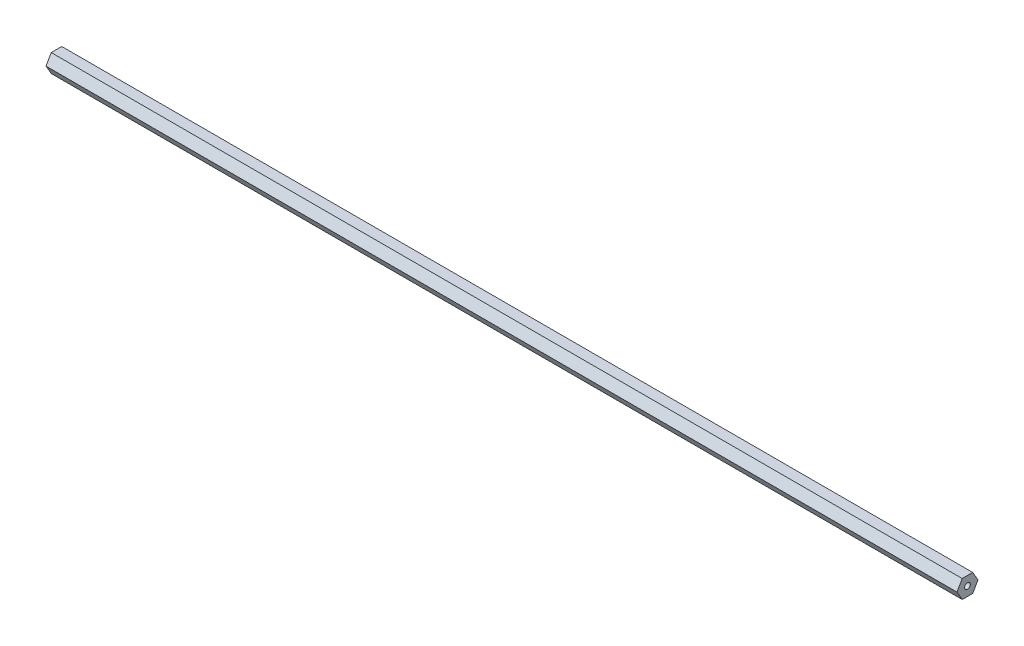
ISO-10303-21;
HEADER;
FILE_DESCRIPTION(('STEP AP214'),'2;1');
FILE_NAME('part.step','',(''),(''),'','','');
FILE_SCHEMA(('AUTOMOTIVE_DESIGN { 1 0 10303 214 1 1 1 1 }'));
ENDSEC;
DATA;
#1=APPLICATION_CONTEXT('core data for automotive mechanical design processes');
#2=APPLICATION_PROTOCOL_DEFINITION('international standard','automotive_design',2000,#1);
#3=PRODUCT_CONTEXT('',#1,'mechanical');
#4=PRODUCT('Part','Part','',(#3));
#5=PRODUCT_RELATED_PRODUCT_CATEGORY('part','',(#4));
#6=PRODUCT_DEFINITION_FORMATION('','',#4);
#7=PRODUCT_DEFINITION_CONTEXT('part definition',#1,'design');
#8=PRODUCT_DEFINITION('design','',#6,#7);
#9=PRODUCT_DEFINITION_SHAPE('','',#8);
#10=(LENGTH_UNIT() NAMED_UNIT(*) SI_UNIT(.MILLI.,.METRE.));
#11=(NAMED_UNIT(*) PLANE_ANGLE_UNIT() SI_UNIT($,.RADIAN.));
#12=(NAMED_UNIT(*) SI_UNIT($,.STERADIAN.) SOLID_ANGLE_UNIT());
#13=UNCERTAINTY_MEASURE_WITH_UNIT(LENGTH_MEASURE(1.E-05),#10,'distance_accuracy_value','');
#14=(GEOMETRIC_REPRESENTATION_CONTEXT(3) GLOBAL_UNCERTAINTY_ASSIGNED_CONTEXT((#13)) GLOBAL_UNIT_ASSIGNED_CONTEXT((#10,
#11,#12)) REPRESENTATION_CONTEXT('',''));
#15=CARTESIAN_POINT('',(0.,0.,0.));
#16=DIRECTION('',(0.,0.,1.));
#17=DIRECTION('',(1.,0.,0.));
#18=AXIS2_PLACEMENT_3D('',#15,#16,#17);
#19=CARTESIAN_POINT('',(635.,0.,0.));
#20=DIRECTION('',(1.,0.,0.));
#21=DIRECTION('',(0.,0.,-1.));
#22=AXIS2_PLACEMENT_3D('',#19,#20,#21);
#23=PLANE('',#22);
#24=DIRECTION('',(0.,0.864751942190741,0.50219924181279));
#25=VECTOR('',#24,1.);
#26=CARTESIAN_POINT('',(635.,0.0186339175626359,-7.33232474120245));
#27=LINE('',#26,#25);
#28=CARTESIAN_POINT('',(635.,0.0186339175626359,-7.33232474120245));
#29=VERTEX_POINT('',#28);
#30=CARTESIAN_POINT('',(635.,6.3592964534598,-3.65002492461996));
#31=VERTEX_POINT('',#30);
#32=EDGE_CURVE('E129',#29,#31,#27,.T.);
#33=ORIENTED_EDGE('',*,*,#32,.T.);
#34=DIRECTION('',(0.,-0.00254133007578982,0.999996770815509));
#35=VECTOR('',#34,1.);
#36=CARTESIAN_POINT('',(635.,6.3592964534598,-3.65002492461996));
#37=LINE('',#36,#35);
#38=CARTESIAN_POINT('',(635.,6.34066253589716,3.68229981658249));
#39=VERTEX_POINT('',#38);
#40=EDGE_CURVE('E87',#31,#39,#37,.T.);
#41=ORIENTED_EDGE('',*,*,#40,.T.);
#42=DIRECTION('',(0.,-0.867293272266531,0.497797529002719));
#43=VECTOR('',#42,1.);
#44=CARTESIAN_POINT('',(635.,6.34066253589716,3.68229981658249));
#45=LINE('',#44,#43);
#46=CARTESIAN_POINT('',(635.,-0.0186339175626376,7.33232474120245));
#47=VERTEX_POINT('',#46);
#48=EDGE_CURVE('E100',#39,#47,#45,.T.);
#49=ORIENTED_EDGE('',*,*,#48,.T.);
#50=DIRECTION('',(0.,-0.864751942190741,-0.502199241812791));
#51=VECTOR('',#50,1.);
#52=CARTESIAN_POINT('',(635.,-0.0186339175626376,7.33232474120245));
#53=LINE('',#52,#51);
#54=CARTESIAN_POINT('',(635.,-6.3592964534598,3.65002492461996));
#55=VERTEX_POINT('',#54);
#56=EDGE_CURVE('E94',#47,#55,#53,.T.);
#57=ORIENTED_EDGE('',*,*,#56,.T.);
#58=DIRECTION('',(0.,0.00254133007578958,-0.999996770815509));
#59=VECTOR('',#58,1.);
#60=CARTESIAN_POINT('',(635.,-6.3592964534598,3.65002492461996));
#61=LINE('',#60,#59);
#62=CARTESIAN_POINT('',(635.,-6.34066253589717,-3.68229981658249));
#63=VERTEX_POINT('',#62);
#64=EDGE_CURVE('E98',#55,#63,#61,.T.);
#65=ORIENTED_EDGE('',*,*,#64,.T.);
#66=DIRECTION('',(0.,0.867293272266531,-0.497797529002719));
#67=VECTOR('',#66,1.);
#68=CARTESIAN_POINT('',(635.,-6.34066253589717,-3.68229981658249));
#69=LINE('',#68,#67);
#70=EDGE_CURVE('E50',#63,#29,#69,.T.);
#71=ORIENTED_EDGE('',*,*,#70,.T.);
#72=EDGE_LOOP('',(#33,#41,#49,#57,#65,#71));
#73=FACE_BOUND('',#72,.T.);
#74=CARTESIAN_POINT('',(635.,0.,0.));
#75=DIRECTION('',(1.,0.,0.));
#76=DIRECTION('',(0.,0.,-1.));
#77=AXIS2_PLACEMENT_3D('',#74,#75,#76);
#78=CIRCLE('',#77,2.00131843668599);
#79=CARTESIAN_POINT('',(635.,0.,2.00131843668599));
#80=VERTEX_POINT('',#79);
#81=EDGE_CURVE('E122',#80,#80,#78,.T.);
#82=ORIENTED_EDGE('',*,*,#81,.F.);
#83=EDGE_LOOP('',(#82));
#84=FACE_BOUND('',#83,.T.);
#85=ADVANCED_FACE('F33',(#73,#84),#23,.T.);
#86=CARTESIAN_POINT('',(0.,0.,0.));
#87=DIRECTION('',(1.,0.,0.));
#88=DIRECTION('',(0.,0.,-1.));
#89=AXIS2_PLACEMENT_3D('',#86,#87,#88);
#90=PLANE('',#89);
#91=DIRECTION('',(0.,0.864751942190741,0.50219924181279));
#92=VECTOR('',#91,1.);
#93=CARTESIAN_POINT('',(0.,0.0186339175626359,-7.33232474120245));
#94=LINE('',#93,#92);
#95=CARTESIAN_POINT('',(0.,0.0186339175626359,-7.33232474120245));
#96=VERTEX_POINT('',#95);
#97=CARTESIAN_POINT('',(0.,6.3592964534598,-3.65002492461996));
#98=VERTEX_POINT('',#97);
#99=EDGE_CURVE('E118',#96,#98,#94,.T.);
#100=ORIENTED_EDGE('',*,*,#99,.F.);
#101=DIRECTION('',(0.,0.867293272266531,-0.497797529002719));
#102=VECTOR('',#101,1.);
#103=CARTESIAN_POINT('',(0.,-6.34066253589717,-3.68229981658249));
#104=LINE('',#103,#102);
#105=CARTESIAN_POINT('',(0.,-6.34066253589717,-3.68229981658249));
#106=VERTEX_POINT('',#105);
#107=EDGE_CURVE('E79',#106,#96,#104,.T.);
#108=ORIENTED_EDGE('',*,*,#107,.F.);
#109=DIRECTION('',(0.,0.00254133007578958,-0.999996770815509));
#110=VECTOR('',#109,1.);
#111=CARTESIAN_POINT('',(0.,-6.3592964534598,3.65002492461996));
#112=LINE('',#111,#110);
#113=CARTESIAN_POINT('',(0.,-6.3592964534598,3.65002492461996));
#114=VERTEX_POINT('',#113);
#115=EDGE_CURVE('E73',#114,#106,#112,.T.);
#116=ORIENTED_EDGE('',*,*,#115,.F.);
#117=DIRECTION('',(0.,-0.864751942190741,-0.502199241812791));
#118=VECTOR('',#117,1.);
#119=CARTESIAN_POINT('',(0.,-0.0186339175626376,7.33232474120245));
#120=LINE('',#119,#118);
#121=CARTESIAN_POINT('',(0.,-0.0186339175626376,7.33232474120245));
#122=VERTEX_POINT('',#121);
#123=EDGE_CURVE('E108',#122,#114,#120,.T.);
#124=ORIENTED_EDGE('',*,*,#123,.F.);
#125=DIRECTION('',(0.,-0.867293272266531,0.497797529002719));
#126=VECTOR('',#125,1.);
#127=CARTESIAN_POINT('',(0.,6.34066253589716,3.68229981658249));
#128=LINE('',#127,#126);
#129=CARTESIAN_POINT('',(0.,6.34066253589716,3.68229981658249));
#130=VERTEX_POINT('',#129);
#131=EDGE_CURVE('E124',#130,#122,#128,.T.);
#132=ORIENTED_EDGE('',*,*,#131,.F.);
#133=DIRECTION('',(0.,-0.00254133007578982,0.999996770815509));
#134=VECTOR('',#133,1.);
#135=CARTESIAN_POINT('',(0.,6.3592964534598,-3.65002492461996));
#136=LINE('',#135,#134);
#137=EDGE_CURVE('E121',#98,#130,#136,.T.);
#138=ORIENTED_EDGE('',*,*,#137,.F.);
#139=EDGE_LOOP('',(#100,#108,#116,#124,#132,#138));
#140=FACE_BOUND('',#139,.T.);
#141=CARTESIAN_POINT('',(0.,0.,0.));
#142=DIRECTION('',(1.,0.,0.));
#143=DIRECTION('',(0.,0.,-1.));
#144=AXIS2_PLACEMENT_3D('',#141,#142,#143);
#145=CIRCLE('',#144,2.00131843668599);
#146=CARTESIAN_POINT('',(-1.11022302462516E-13,0.,2.00131843668599));
#147=VERTEX_POINT('',#146);
#148=EDGE_CURVE('E222',#147,#147,#145,.T.);
#149=ORIENTED_EDGE('',*,*,#148,.T.);
#150=EDGE_LOOP('',(#149));
#151=FACE_BOUND('',#150,.T.);
#152=ADVANCED_FACE('F138',(#140,#151),#90,.F.);
#153=CARTESIAN_POINT('',(635.,0.0186339175626359,-7.33232474120245));
#154=DIRECTION('',(0.,-0.50219924181279,0.864751942190741));
#155=DIRECTION('',(0.,-0.864751942190741,-0.50219924181279));
#156=AXIS2_PLACEMENT_3D('',#153,#154,#155);
#157=PLANE('',#156);
#158=ORIENTED_EDGE('',*,*,#99,.T.);
#159=DIRECTION('',(-1.,0.,0.));
#160=VECTOR('',#159,1.);
#161=CARTESIAN_POINT('',(635.,6.3592964534598,-3.65002492461996));
#162=LINE('',#161,#160);
#163=EDGE_CURVE('E11',#31,#98,#162,.T.);
#164=ORIENTED_EDGE('',*,*,#163,.F.);
#165=ORIENTED_EDGE('',*,*,#32,.F.);
#166=DIRECTION('',(-1.,0.,0.));
#167=VECTOR('',#166,1.);
#168=CARTESIAN_POINT('',(635.,0.0186339175626359,-7.33232474120245));
#169=LINE('',#168,#167);
#170=EDGE_CURVE('E114',#29,#96,#169,.T.);
#171=ORIENTED_EDGE('',*,*,#170,.T.);
#172=EDGE_LOOP('',(#158,#164,#165,#171));
#173=FACE_BOUND('',#172,.T.);
#174=ADVANCED_FACE('F35',(#173),#157,.F.);
#175=CARTESIAN_POINT('',(635.,6.3592964534598,-3.65002492461996));
#176=DIRECTION('',(0.,-0.999996770815509,-0.00254133007578982));
#177=DIRECTION('',(0.,0.00254133007578982,-0.999996770815509));
#178=AXIS2_PLACEMENT_3D('',#175,#176,#177);
#179=PLANE('',#178);
#180=ORIENTED_EDGE('',*,*,#137,.T.);
#181=DIRECTION('',(-1.,0.,0.));
#182=VECTOR('',#181,1.);
#183=CARTESIAN_POINT('',(635.,6.34066253589716,3.68229981658249));
#184=LINE('',#183,#182);
#185=EDGE_CURVE('E42',#39,#130,#184,.T.);
#186=ORIENTED_EDGE('',*,*,#185,.F.);
#187=ORIENTED_EDGE('',*,*,#40,.F.);
#188=ORIENTED_EDGE('',*,*,#163,.T.);
#189=EDGE_LOOP('',(#180,#186,#187,#188));
#190=FACE_BOUND('',#189,.T.);
#191=ADVANCED_FACE('F163',(#190),#179,.F.);
#192=CARTESIAN_POINT('',(635.,6.34066253589716,3.68229981658249));
#193=DIRECTION('',(0.,-0.497797529002719,-0.867293272266531));
#194=DIRECTION('',(0.,0.867293272266531,-0.497797529002719));
#195=AXIS2_PLACEMENT_3D('',#192,#193,#194);
#196=PLANE('',#195);
#197=ORIENTED_EDGE('',*,*,#131,.T.);
#198=DIRECTION('',(-1.,0.,0.));
#199=VECTOR('',#198,1.);
#200=CARTESIAN_POINT('',(635.,-0.0186339175626376,7.33232474120245));
#201=LINE('',#200,#199);
#202=EDGE_CURVE('E109',#47,#122,#201,.T.);
#203=ORIENTED_EDGE('',*,*,#202,.F.);
#204=ORIENTED_EDGE('',*,*,#48,.F.);
#205=ORIENTED_EDGE('',*,*,#185,.T.);
#206=EDGE_LOOP('',(#197,#203,#204,#205));
#207=FACE_BOUND('',#206,.T.);
#208=ADVANCED_FACE('F135',(#207),#196,.F.);
#209=CARTESIAN_POINT('',(635.,-0.0186339175626376,7.33232474120245));
#210=DIRECTION('',(0.,0.50219924181279,-0.864751942190741));
#211=DIRECTION('',(0.,0.864751942190741,0.502199241812791));
#212=AXIS2_PLACEMENT_3D('',#209,#210,#211);
#213=PLANE('',#212);
#214=ORIENTED_EDGE('',*,*,#123,.T.);
#215=DIRECTION('',(-1.,0.,0.));
#216=VECTOR('',#215,1.);
#217=CARTESIAN_POINT('',(635.,-6.3592964534598,3.65002492461996));
#218=LINE('',#217,#216);
#219=EDGE_CURVE('E105',#55,#114,#218,.T.);
#220=ORIENTED_EDGE('',*,*,#219,.F.);
#221=ORIENTED_EDGE('',*,*,#56,.F.);
#222=ORIENTED_EDGE('',*,*,#202,.T.);
#223=EDGE_LOOP('',(#214,#220,#221,#222));
#224=FACE_BOUND('',#223,.T.);
#225=ADVANCED_FACE('F106',(#224),#213,.F.);
#226=CARTESIAN_POINT('',(635.,-6.3592964534598,3.65002492461996));
#227=DIRECTION('',(0.,0.999996770815509,0.00254133007578958));
#228=DIRECTION('',(0.,-0.00254133007578958,0.999996770815509));
#229=AXIS2_PLACEMENT_3D('',#226,#227,#228);
#230=PLANE('',#229);
#231=ORIENTED_EDGE('',*,*,#115,.T.);
#232=DIRECTION('',(-1.,0.,0.));
#233=VECTOR('',#232,1.);
#234=CARTESIAN_POINT('',(635.,-6.34066253589717,-3.68229981658249));
#235=LINE('',#234,#233);
#236=EDGE_CURVE('E110',#63,#106,#235,.T.);
#237=ORIENTED_EDGE('',*,*,#236,.F.);
#238=ORIENTED_EDGE('',*,*,#64,.F.);
#239=ORIENTED_EDGE('',*,*,#219,.T.);
#240=EDGE_LOOP('',(#231,#237,#238,#239));
#241=FACE_BOUND('',#240,.T.);
#242=ADVANCED_FACE('F112',(#241),#230,.F.);
#243=CARTESIAN_POINT('',(635.,-6.34066253589717,-3.68229981658249));
#244=DIRECTION('',(0.,0.497797529002719,0.867293272266531));
#245=DIRECTION('',(0.,-0.867293272266531,0.497797529002719));
#246=AXIS2_PLACEMENT_3D('',#243,#244,#245);
#247=PLANE('',#246);
#248=ORIENTED_EDGE('',*,*,#107,.T.);
#249=ORIENTED_EDGE('',*,*,#170,.F.);
#250=ORIENTED_EDGE('',*,*,#70,.F.);
#251=ORIENTED_EDGE('',*,*,#236,.T.);
#252=EDGE_LOOP('',(#248,#249,#250,#251));
#253=FACE_BOUND('',#252,.T.);
#254=ADVANCED_FACE('F143',(#253),#247,.F.);
#255=CARTESIAN_POINT('',(635.,0.,0.));
#256=DIRECTION('',(-1.,0.,0.));
#257=DIRECTION('',(0.,0.,1.));
#258=AXIS2_PLACEMENT_3D('',#255,#256,#257);
#259=CYLINDRICAL_SURFACE('',#258,2.00131843668599);
#260=CARTESIAN_POINT('',(635.,0.,2.00131843668599));
#261=CARTESIAN_POINT('',(628.385416666667,0.,2.00131843668599));
#262=CARTESIAN_POINT('',(621.770833333333,0.,2.00131843668599));
#263=CARTESIAN_POINT('',(608.541666666667,0.,2.00131843668599));
#264=CARTESIAN_POINT('',(601.927083333333,0.,2.00131843668599));
#265=CARTESIAN_POINT('',(588.697916666667,0.,2.00131843668599));
#266=CARTESIAN_POINT('',(582.083333333333,0.,2.00131843668599));
#267=CARTESIAN_POINT('',(568.854166666667,0.,2.00131843668599));
#268=CARTESIAN_POINT('',(562.239583333333,0.,2.00131843668599));
#269=CARTESIAN_POINT('',(549.010416666667,0.,2.00131843668599));
#270=CARTESIAN_POINT('',(542.395833333333,0.,2.00131843668599));
#271=CARTESIAN_POINT('',(529.166666666667,0.,2.00131843668599));
#272=CARTESIAN_POINT('',(522.552083333333,0.,2.00131843668599));
#273=CARTESIAN_POINT('',(509.322916666667,0.,2.00131843668599));
#274=CARTESIAN_POINT('',(502.708333333333,0.,2.00131843668599));
#275=CARTESIAN_POINT('',(489.479166666667,0.,2.00131843668599));
#276=CARTESIAN_POINT('',(482.864583333333,0.,2.00131843668599));
#277=CARTESIAN_POINT('',(469.635416666667,0.,2.00131843668599));
#278=CARTESIAN_POINT('',(463.020833333333,0.,2.00131843668599));
#279=CARTESIAN_POINT('',(449.791666666667,0.,2.00131843668599));
#280=CARTESIAN_POINT('',(443.177083333333,0.,2.00131843668599));
#281=CARTESIAN_POINT('',(429.947916666667,0.,2.00131843668599));
#282=CARTESIAN_POINT('',(423.333333333333,0.,2.00131843668599));
#283=CARTESIAN_POINT('',(410.104166666667,0.,2.00131843668599));
#284=CARTESIAN_POINT('',(403.489583333333,0.,2.00131843668599));
#285=CARTESIAN_POINT('',(390.260416666667,0.,2.00131843668599));
#286=CARTESIAN_POINT('',(383.645833333333,0.,2.00131843668599));
#287=CARTESIAN_POINT('',(370.416666666667,0.,2.00131843668599));
#288=CARTESIAN_POINT('',(363.802083333333,0.,2.00131843668599));
#289=CARTESIAN_POINT('',(350.572916666667,0.,2.00131843668599));
#290=CARTESIAN_POINT('',(343.958333333333,0.,2.00131843668599));
#291=CARTESIAN_POINT('',(330.729166666667,0.,2.00131843668599));
#292=CARTESIAN_POINT('',(324.114583333333,0.,2.00131843668599));
#293=CARTESIAN_POINT('',(310.885416666667,0.,2.00131843668599));
#294=CARTESIAN_POINT('',(304.270833333333,0.,2.00131843668599));
#295=CARTESIAN_POINT('',(291.041666666667,0.,2.00131843668599));
#296=CARTESIAN_POINT('',(284.427083333333,0.,2.00131843668599));
#297=CARTESIAN_POINT('',(271.197916666667,0.,2.00131843668599));
#298=CARTESIAN_POINT('',(264.583333333333,0.,2.00131843668599));
#299=CARTESIAN_POINT('',(251.354166666667,0.,2.00131843668599));
#300=CARTESIAN_POINT('',(244.739583333333,0.,2.00131843668599));
#301=CARTESIAN_POINT('',(231.510416666667,0.,2.00131843668599));
#302=CARTESIAN_POINT('',(224.895833333333,0.,2.00131843668599));
#303=CARTESIAN_POINT('',(211.666666666667,0.,2.00131843668599));
#304=CARTESIAN_POINT('',(205.052083333333,0.,2.00131843668599));
#305=CARTESIAN_POINT('',(191.822916666666,0.,2.00131843668599));
#306=CARTESIAN_POINT('',(185.208333333333,0.,2.00131843668599));
#307=CARTESIAN_POINT('',(171.979166666666,0.,2.00131843668599));
#308=CARTESIAN_POINT('',(165.364583333333,0.,2.00131843668599));
#309=CARTESIAN_POINT('',(152.135416666666,0.,2.00131843668599));
#310=CARTESIAN_POINT('',(145.520833333333,0.,2.00131843668599));
#311=CARTESIAN_POINT('',(132.291666666667,0.,2.00131843668599));
#312=CARTESIAN_POINT('',(125.677083333333,0.,2.00131843668599));
#313=CARTESIAN_POINT('',(112.447916666667,0.,2.00131843668599));
#314=CARTESIAN_POINT('',(105.833333333333,0.,2.00131843668599));
#315=CARTESIAN_POINT('',(92.6041666666666,0.,2.00131843668599));
#316=CARTESIAN_POINT('',(85.9895833333332,0.,2.00131843668599));
#317=CARTESIAN_POINT('',(72.7604166666665,0.,2.00131843668599));
#318=CARTESIAN_POINT('',(66.1458333333332,0.,2.00131843668599));
#319=CARTESIAN_POINT('',(52.9166666666666,0.,2.00131843668599));
#320=CARTESIAN_POINT('',(46.3020833333332,0.,2.00131843668599));
#321=CARTESIAN_POINT('',(33.0729166666666,0.,2.00131843668599));
#322=CARTESIAN_POINT('',(26.4583333333333,0.,2.00131843668599));
#323=CARTESIAN_POINT('',(13.2291666666666,0.,2.00131843668599));
#324=CARTESIAN_POINT('',(6.61458333333324,0.,2.00131843668599));
#325=CARTESIAN_POINT('',(-1.11022302462516E-13,0.,2.00131843668599));
#326=B_SPLINE_CURVE_WITH_KNOTS('',3,(#260,#261,#262,#263,#264,#265,#266,#267,#268,#269,#270,
#271,#272,#273,#274,#275,#276,#277,#278,#279,#280,#281,#282,#283,#284,#285,#286,#287,#288,#289,
#290,#291,#292,#293,#294,#295,#296,#297,#298,#299,#300,#301,#302,#303,#304,#305,#306,#307,#308,
#309,#310,#311,#312,#313,#314,#315,#316,#317,#318,#319,#320,#321,#322,#323,#324,#325),
.UNSPECIFIED.,.F.,.F.,(4,2,2,2,2,2,2,2,2,2,2,2,2,2,2,2,2,2,2,2,2,2,2,2,2,2,2,2,2,2,2,2,4),(0.,
19.84375,39.6875000000001,59.53125,79.3750000000001,99.2187500000001,119.0625,138.90625,158.75,
178.59375,198.4375,218.28125,238.125,257.96875,277.8125,297.65625,317.5,337.34375,357.1875,
377.03125,396.875,416.71875,436.5625,456.40625,476.25,496.09375,515.9375,535.78125,555.625,
575.46875,595.3125,615.15625,635.),.UNSPECIFIED.);
#327=EDGE_CURVE('BSEAM145',#80,#147,#326,.T.);
#328=ORIENTED_EDGE('',*,*,#81,.T.);
#329=ORIENTED_EDGE('',*,*,#148,.F.);
#330=ORIENTED_EDGE('',*,*,#327,.T.);
#331=ORIENTED_EDGE('',*,*,#327,.F.);
#332=EDGE_LOOP('',(#328,#330,#329,#331));
#333=FACE_BOUND('',#332,.T.);
#334=ADVANCED_FACE('F145',(#333),#259,.F.);
#335=CLOSED_SHELL('',(#85,#152,#174,#191,#208,#225,#242,#254,#334));
#336=MANIFOLD_SOLID_BREP('B2',#335);
#337=ADVANCED_BREP_SHAPE_REPRESENTATION('',(#18,#336),#14);
#338=SHAPE_DEFINITION_REPRESENTATION(#9,#337);
ENDSEC;
END-ISO-10303-21;
